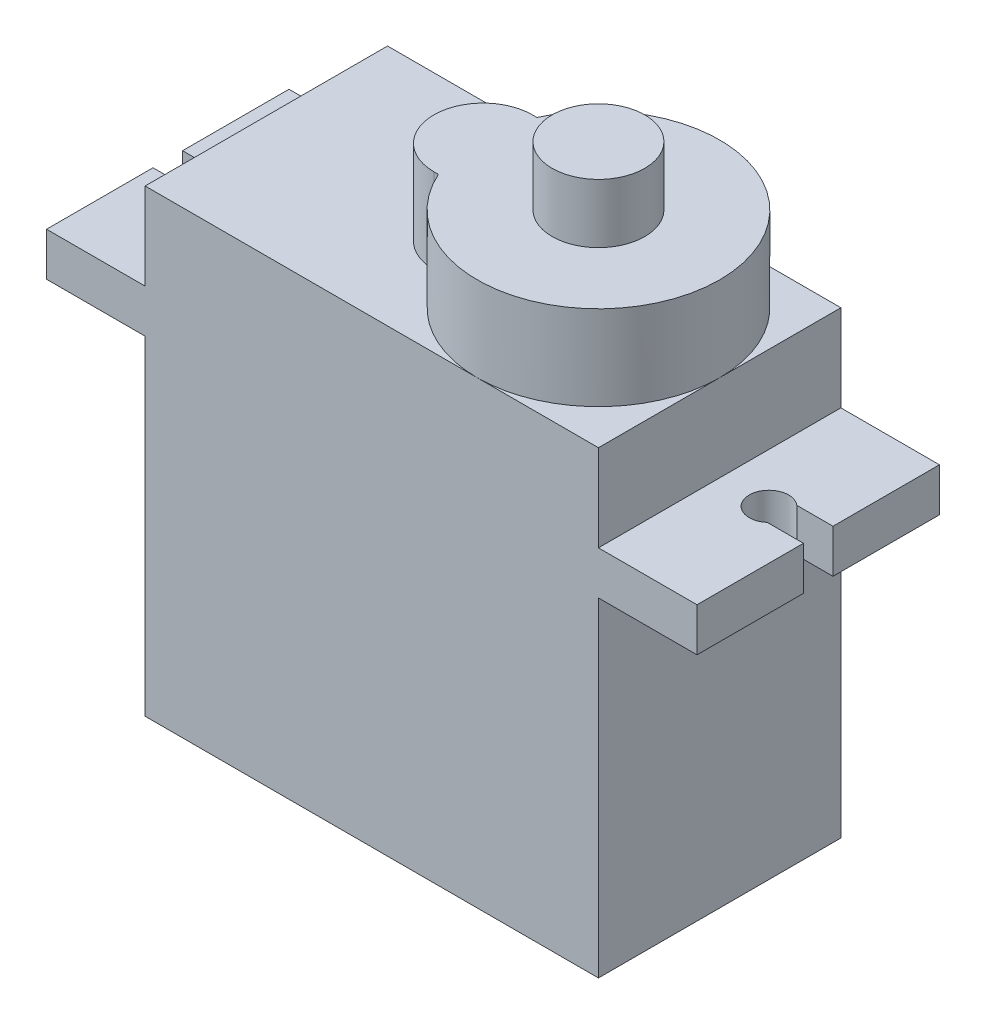
ISO-10303-21;
HEADER;
FILE_DESCRIPTION(('STEP AP214'),'2;1');
FILE_NAME('part.step','',(''),(''),'','','');
FILE_SCHEMA(('AUTOMOTIVE_DESIGN { 1 0 10303 214 1 1 1 1 }'));
ENDSEC;
DATA;
#1=APPLICATION_CONTEXT('core data for automotive mechanical design processes');
#2=APPLICATION_PROTOCOL_DEFINITION('international standard','automotive_design',2000,#1);
#3=PRODUCT_CONTEXT('',#1,'mechanical');
#4=PRODUCT('Part','Part','',(#3));
#5=PRODUCT_RELATED_PRODUCT_CATEGORY('part','',(#4));
#6=PRODUCT_DEFINITION_FORMATION('','',#4);
#7=PRODUCT_DEFINITION_CONTEXT('part definition',#1,'design');
#8=PRODUCT_DEFINITION('design','',#6,#7);
#9=PRODUCT_DEFINITION_SHAPE('','',#8);
#10=(LENGTH_UNIT() NAMED_UNIT(*) SI_UNIT(.MILLI.,.METRE.));
#11=(NAMED_UNIT(*) PLANE_ANGLE_UNIT() SI_UNIT($,.RADIAN.));
#12=(NAMED_UNIT(*) SI_UNIT($,.STERADIAN.) SOLID_ANGLE_UNIT());
#13=UNCERTAINTY_MEASURE_WITH_UNIT(LENGTH_MEASURE(1.E-05),#10,'distance_accuracy_value','');
#14=(GEOMETRIC_REPRESENTATION_CONTEXT(3) GLOBAL_UNCERTAINTY_ASSIGNED_CONTEXT((#13)) GLOBAL_UNIT_ASSIGNED_CONTEXT((#10,
#11,#12)) REPRESENTATION_CONTEXT('',''));
#15=CARTESIAN_POINT('',(0.,0.,0.));
#16=DIRECTION('',(0.,0.,1.));
#17=DIRECTION('',(1.,0.,0.));
#18=AXIS2_PLACEMENT_3D('',#15,#16,#17);
#19=CARTESIAN_POINT('',(0.,27.6,0.));
#20=DIRECTION('',(0.,1.,0.));
#21=DIRECTION('',(0.,0.,1.));
#22=AXIS2_PLACEMENT_3D('',#19,#20,#21);
#23=PLANE('',#22);
#24=CARTESIAN_POINT('',(16.85,27.6,-6.14999999999991));
#25=DIRECTION('',(0.,1.,0.));
#26=DIRECTION('',(0.,0.,1.));
#27=AXIS2_PLACEMENT_3D('',#24,#25,#26);
#28=CIRCLE('',#27,6.14999999999998);
#29=CARTESIAN_POINT('',(11.2310588186029,27.6,-3.65));
#30=VERTEX_POINT('',#29);
#31=CARTESIAN_POINT('',(11.231058818603,27.6,-8.65));
#32=VERTEX_POINT('',#31);
#33=EDGE_CURVE('E211',#30,#32,#28,.T.);
#34=ORIENTED_EDGE('',*,*,#33,.T.);
#35=DIRECTION('',(1.,0.,0.));
#36=VECTOR('',#35,1.);
#37=CARTESIAN_POINT('',(0.,27.6,-8.65));
#38=LINE('',#37,#36);
#39=CARTESIAN_POINT('',(11.,27.6,-8.65));
#40=VERTEX_POINT('',#39);
#41=EDGE_CURVE('E213',#40,#32,#38,.T.);
#42=ORIENTED_EDGE('',*,*,#41,.F.);
#43=CARTESIAN_POINT('',(11.,27.6,-6.15));
#44=DIRECTION('',(0.,1.,0.));
#45=DIRECTION('',(0.,0.,1.));
#46=AXIS2_PLACEMENT_3D('',#43,#44,#45);
#47=CIRCLE('',#46,2.5);
#48=CARTESIAN_POINT('',(11.,27.6,-3.65));
#49=VERTEX_POINT('',#48);
#50=EDGE_CURVE('E230',#40,#49,#47,.T.);
#51=ORIENTED_EDGE('',*,*,#50,.T.);
#52=DIRECTION('',(1.,0.,0.));
#53=VECTOR('',#52,1.);
#54=CARTESIAN_POINT('',(0.,27.6,-3.65));
#55=LINE('',#54,#53);
#56=EDGE_CURVE('E215',#49,#30,#55,.T.);
#57=ORIENTED_EDGE('',*,*,#56,.T.);
#58=EDGE_LOOP('',(#34,#42,#51,#57));
#59=FACE_BOUND('',#58,.T.);
#60=CARTESIAN_POINT('',(16.85,27.6,-6.14999999999991));
#61=DIRECTION('',(0.,1.,0.));
#62=DIRECTION('',(0.,0.,1.));
#63=AXIS2_PLACEMENT_3D('',#60,#61,#62);
#64=CIRCLE('',#63,2.35);
#65=CARTESIAN_POINT('',(16.85,27.6,-3.79999999999991));
#66=VERTEX_POINT('',#65);
#67=EDGE_CURVE('E805',#66,#66,#64,.T.);
#68=ORIENTED_EDGE('',*,*,#67,.F.);
#69=EDGE_LOOP('',(#68));
#70=FACE_BOUND('',#69,.T.);
#71=ADVANCED_FACE('F36',(#59,#70),#23,.T.);
#72=CARTESIAN_POINT('',(0.,23.3,0.));
#73=DIRECTION('',(0.,1.,0.));
#74=DIRECTION('',(0.,0.,1.));
#75=AXIS2_PLACEMENT_3D('',#72,#73,#74);
#76=PLANE('',#75);
#77=CARTESIAN_POINT('',(16.85,23.3,-6.14999999999991));
#78=DIRECTION('',(0.,1.,0.));
#79=DIRECTION('',(0.,0.,1.));
#80=AXIS2_PLACEMENT_3D('',#77,#78,#79);
#81=CIRCLE('',#80,6.14999999999998);
#82=CARTESIAN_POINT('',(11.2310588186029,23.3,-3.65));
#83=VERTEX_POINT('',#82);
#84=CARTESIAN_POINT('',(16.85,23.3,0.));
#85=VERTEX_POINT('',#84);
#86=EDGE_CURVE('E47',#83,#85,#81,.T.);
#87=ORIENTED_EDGE('',*,*,#86,.F.);
#88=DIRECTION('',(1.,0.,0.));
#89=VECTOR('',#88,1.);
#90=CARTESIAN_POINT('',(0.,23.3,-3.65));
#91=LINE('',#90,#89);
#92=CARTESIAN_POINT('',(11.,23.3,-3.65));
#93=VERTEX_POINT('',#92);
#94=EDGE_CURVE('E219',#93,#83,#91,.T.);
#95=ORIENTED_EDGE('',*,*,#94,.F.);
#96=CARTESIAN_POINT('',(11.,23.3,-6.15));
#97=DIRECTION('',(0.,1.,0.));
#98=DIRECTION('',(0.,0.,1.));
#99=AXIS2_PLACEMENT_3D('',#96,#97,#98);
#100=CIRCLE('',#99,2.5);
#101=CARTESIAN_POINT('',(11.,23.3,-8.65));
#102=VERTEX_POINT('',#101);
#103=EDGE_CURVE('E240',#102,#93,#100,.T.);
#104=ORIENTED_EDGE('',*,*,#103,.F.);
#105=DIRECTION('',(1.,0.,0.));
#106=VECTOR('',#105,1.);
#107=CARTESIAN_POINT('',(0.,23.3,-8.65));
#108=LINE('',#107,#106);
#109=CARTESIAN_POINT('',(11.231058818603,23.3,-8.65));
#110=VERTEX_POINT('',#109);
#111=EDGE_CURVE('E237',#102,#110,#108,.T.);
#112=ORIENTED_EDGE('',*,*,#111,.T.);
#113=CARTESIAN_POINT('',(16.85,23.3,-12.2999999999999));
#114=VERTEX_POINT('',#113);
#115=EDGE_CURVE('E223',#114,#110,#81,.T.);
#116=ORIENTED_EDGE('',*,*,#115,.F.);
#117=DIRECTION('',(-1.,0.,0.));
#118=VECTOR('',#117,1.);
#119=CARTESIAN_POINT('',(0.,23.3,-12.3));
#120=LINE('',#119,#118);
#121=CARTESIAN_POINT('',(0.,23.3,-12.3));
#122=VERTEX_POINT('',#121);
#123=EDGE_CURVE('E403',#114,#122,#120,.T.);
#124=ORIENTED_EDGE('',*,*,#123,.T.);
#125=DIRECTION('',(0.,0.,1.));
#126=VECTOR('',#125,1.);
#127=CARTESIAN_POINT('',(0.,23.3,0.));
#128=LINE('',#127,#126);
#129=CARTESIAN_POINT('',(0.,23.3,0.));
#130=VERTEX_POINT('',#129);
#131=EDGE_CURVE('E402',#122,#130,#128,.T.);
#132=ORIENTED_EDGE('',*,*,#131,.T.);
#133=DIRECTION('',(1.,0.,0.));
#134=VECTOR('',#133,1.);
#135=CARTESIAN_POINT('',(0.,23.3,0.));
#136=LINE('',#135,#134);
#137=EDGE_CURVE('E337',#130,#85,#136,.T.);
#138=ORIENTED_EDGE('',*,*,#137,.T.);
#139=EDGE_LOOP('',(#87,#95,#104,#112,#116,#124,#132,#138));
#140=FACE_BOUND('',#139,.T.);
#141=ADVANCED_FACE('F505',(#140),#76,.T.);
#142=CARTESIAN_POINT('',(23.,23.3,-6.14999999999991));
#143=VERTEX_POINT('',#142);
#144=EDGE_CURVE('E11',#85,#143,#81,.T.);
#145=ORIENTED_EDGE('',*,*,#144,.F.);
#146=CARTESIAN_POINT('',(23.,23.3,0.));
#147=VERTEX_POINT('',#146);
#148=EDGE_CURVE('E405',#85,#147,#136,.T.);
#149=ORIENTED_EDGE('',*,*,#148,.T.);
#150=DIRECTION('',(0.,0.,-1.));
#151=VECTOR('',#150,1.);
#152=CARTESIAN_POINT('',(23.,23.3,0.));
#153=LINE('',#152,#151);
#154=EDGE_CURVE('E408',#147,#143,#153,.T.);
#155=ORIENTED_EDGE('',*,*,#154,.T.);
#156=EDGE_LOOP('',(#145,#149,#155));
#157=FACE_BOUND('',#156,.T.);
#158=ADVANCED_FACE('F510',(#157),#76,.T.);
#159=CARTESIAN_POINT('',(23.,16.7,-17.7626001134991));
#160=DIRECTION('',(0.,-1.,0.));
#161=DIRECTION('',(0.,0.,-1.));
#162=AXIS2_PLACEMENT_3D('',#159,#160,#161);
#163=PLANE('',#162);
#164=CARTESIAN_POINT('',(-2.5,16.7,-6.15));
#165=DIRECTION('',(0.,-1.,0.));
#166=DIRECTION('',(0.,0.,-1.));
#167=AXIS2_PLACEMENT_3D('',#164,#165,#166);
#168=CIRCLE('',#167,1.);
#169=CARTESIAN_POINT('',(-3.16143782776615,16.7,-5.4));
#170=VERTEX_POINT('',#169);
#171=CARTESIAN_POINT('',(-3.16143782776615,16.7,-6.9));
#172=VERTEX_POINT('',#171);
#173=EDGE_CURVE('E266',#170,#172,#168,.F.);
#174=ORIENTED_EDGE('',*,*,#173,.T.);
#175=DIRECTION('',(-1.,0.,0.));
#176=VECTOR('',#175,1.);
#177=CARTESIAN_POINT('',(23.,16.7,-6.9));
#178=LINE('',#177,#176);
#179=CARTESIAN_POINT('',(-5.,16.7,-6.9));
#180=VERTEX_POINT('',#179);
#181=EDGE_CURVE('E269',#172,#180,#178,.T.);
#182=ORIENTED_EDGE('',*,*,#181,.T.);
#183=DIRECTION('',(0.,0.,1.));
#184=VECTOR('',#183,1.);
#185=CARTESIAN_POINT('',(-5.,16.7,-17.7626001134991));
#186=LINE('',#185,#184);
#187=CARTESIAN_POINT('',(-5.,16.7,-12.3));
#188=VERTEX_POINT('',#187);
#189=EDGE_CURVE('E282',#188,#180,#186,.T.);
#190=ORIENTED_EDGE('',*,*,#189,.F.);
#191=DIRECTION('',(-1.,0.,0.));
#192=VECTOR('',#191,1.);
#193=CARTESIAN_POINT('',(23.,16.7,-12.3));
#194=LINE('',#193,#192);
#195=CARTESIAN_POINT('',(0.,16.7,-12.3));
#196=VERTEX_POINT('',#195);
#197=EDGE_CURVE('E275',#196,#188,#194,.T.);
#198=ORIENTED_EDGE('',*,*,#197,.F.);
#199=DIRECTION('',(0.,0.,1.));
#200=VECTOR('',#199,1.);
#201=CARTESIAN_POINT('',(0.,16.7,-17.7626001134991));
#202=LINE('',#201,#200);
#203=CARTESIAN_POINT('',(0.,16.7,0.));
#204=VERTEX_POINT('',#203);
#205=EDGE_CURVE('E280',#196,#204,#202,.T.);
#206=ORIENTED_EDGE('',*,*,#205,.T.);
#207=DIRECTION('',(1.,0.,0.));
#208=VECTOR('',#207,1.);
#209=CARTESIAN_POINT('',(23.,16.7,0.));
#210=LINE('',#209,#208);
#211=CARTESIAN_POINT('',(-5.,16.7,0.));
#212=VERTEX_POINT('',#211);
#213=EDGE_CURVE('E272',#212,#204,#210,.T.);
#214=ORIENTED_EDGE('',*,*,#213,.F.);
#215=CARTESIAN_POINT('',(-5.,16.7,-5.4));
#216=VERTEX_POINT('',#215);
#217=EDGE_CURVE('E285',#216,#212,#186,.T.);
#218=ORIENTED_EDGE('',*,*,#217,.F.);
#219=DIRECTION('',(1.,0.,0.));
#220=VECTOR('',#219,1.);
#221=CARTESIAN_POINT('',(23.,16.7,-5.4));
#222=LINE('',#221,#220);
#223=EDGE_CURVE('E258',#216,#170,#222,.T.);
#224=ORIENTED_EDGE('',*,*,#223,.T.);
#225=EDGE_LOOP('',(#174,#182,#190,#198,#206,#214,#218,#224));
#226=FACE_BOUND('',#225,.T.);
#227=ADVANCED_FACE('F480',(#226),#163,.T.);
#228=CARTESIAN_POINT('',(-5.,0.,-17.7626001134991));
#229=DIRECTION('',(-1.,0.,0.));
#230=DIRECTION('',(0.,0.,1.));
#231=AXIS2_PLACEMENT_3D('',#228,#229,#230);
#232=PLANE('',#231);
#233=ORIENTED_EDGE('',*,*,#189,.T.);
#234=DIRECTION('',(0.,1.,0.));
#235=VECTOR('',#234,1.);
#236=CARTESIAN_POINT('',(-5.,-2.50000000007189E-05,-6.9));
#237=LINE('',#236,#235);
#238=CARTESIAN_POINT('',(-5.,18.9,-6.9));
#239=VERTEX_POINT('',#238);
#240=EDGE_CURVE('E255',#180,#239,#237,.T.);
#241=ORIENTED_EDGE('',*,*,#240,.T.);
#242=DIRECTION('',(0.,0.,1.));
#243=VECTOR('',#242,1.);
#244=CARTESIAN_POINT('',(-5.,18.9,-17.7626001134991));
#245=LINE('',#244,#243);
#246=CARTESIAN_POINT('',(-5.,18.9,-12.3));
#247=VERTEX_POINT('',#246);
#248=EDGE_CURVE('E286',#247,#239,#245,.T.);
#249=ORIENTED_EDGE('',*,*,#248,.F.);
#250=DIRECTION('',(0.,1.,0.));
#251=VECTOR('',#250,1.);
#252=CARTESIAN_POINT('',(-5.,0.,-12.3));
#253=LINE('',#252,#251);
#254=EDGE_CURVE('E273',#188,#247,#253,.T.);
#255=ORIENTED_EDGE('',*,*,#254,.F.);
#256=EDGE_LOOP('',(#233,#241,#249,#255));
#257=FACE_BOUND('',#256,.T.);
#258=ADVANCED_FACE('F484',(#257),#232,.T.);
#259=CARTESIAN_POINT('',(-5.,18.9,-5.4));
#260=VERTEX_POINT('',#259);
#261=CARTESIAN_POINT('',(-5.,18.9,0.));
#262=VERTEX_POINT('',#261);
#263=EDGE_CURVE('E289',#260,#262,#245,.T.);
#264=ORIENTED_EDGE('',*,*,#263,.F.);
#265=DIRECTION('',(0.,1.,0.));
#266=VECTOR('',#265,1.);
#267=CARTESIAN_POINT('',(-5.,-2.50000000007189E-05,-5.4));
#268=LINE('',#267,#266);
#269=EDGE_CURVE('E62',#216,#260,#268,.T.);
#270=ORIENTED_EDGE('',*,*,#269,.F.);
#271=ORIENTED_EDGE('',*,*,#217,.T.);
#272=DIRECTION('',(0.,-1.,0.));
#273=VECTOR('',#272,1.);
#274=CARTESIAN_POINT('',(-5.,0.,0.));
#275=LINE('',#274,#273);
#276=EDGE_CURVE('E277',#262,#212,#275,.T.);
#277=ORIENTED_EDGE('',*,*,#276,.F.);
#278=EDGE_LOOP('',(#264,#270,#271,#277));
#279=FACE_BOUND('',#278,.T.);
#280=ADVANCED_FACE('F495',(#279),#232,.T.);
#281=CARTESIAN_POINT('',(23.,18.9,-17.7626001134991));
#282=DIRECTION('',(0.,1.,0.));
#283=DIRECTION('',(0.,0.,1.));
#284=AXIS2_PLACEMENT_3D('',#281,#282,#283);
#285=PLANE('',#284);
#286=ORIENTED_EDGE('',*,*,#248,.T.);
#287=DIRECTION('',(1.,0.,0.));
#288=VECTOR('',#287,1.);
#289=CARTESIAN_POINT('',(-5.,18.9,-6.9));
#290=LINE('',#289,#288);
#291=CARTESIAN_POINT('',(-3.16143782776615,18.9,-6.9));
#292=VERTEX_POINT('',#291);
#293=EDGE_CURVE('E252',#239,#292,#290,.T.);
#294=ORIENTED_EDGE('',*,*,#293,.T.);
#295=CARTESIAN_POINT('',(-2.5,18.9,-6.15));
#296=DIRECTION('',(0.,-1.,0.));
#297=DIRECTION('',(0.,0.,1.));
#298=AXIS2_PLACEMENT_3D('',#295,#296,#297);
#299=CIRCLE('',#298,1.);
#300=CARTESIAN_POINT('',(-3.16143782776615,18.9,-5.4));
#301=VERTEX_POINT('',#300);
#302=EDGE_CURVE('E249',#292,#301,#299,.T.);
#303=ORIENTED_EDGE('',*,*,#302,.T.);
#304=DIRECTION('',(-1.,0.,0.));
#305=VECTOR('',#304,1.);
#306=CARTESIAN_POINT('',(-5.,18.9,-5.4));
#307=LINE('',#306,#305);
#308=EDGE_CURVE('E225',#301,#260,#307,.T.);
#309=ORIENTED_EDGE('',*,*,#308,.T.);
#310=ORIENTED_EDGE('',*,*,#263,.T.);
#311=DIRECTION('',(-1.,0.,0.));
#312=VECTOR('',#311,1.);
#313=CARTESIAN_POINT('',(23.,18.9,0.));
#314=LINE('',#313,#312);
#315=CARTESIAN_POINT('',(0.,18.9,0.));
#316=VERTEX_POINT('',#315);
#317=EDGE_CURVE('E281',#316,#262,#314,.T.);
#318=ORIENTED_EDGE('',*,*,#317,.F.);
#319=DIRECTION('',(0.,0.,1.));
#320=VECTOR('',#319,1.);
#321=CARTESIAN_POINT('',(0.,18.9,-17.7626001134991));
#322=LINE('',#321,#320);
#323=CARTESIAN_POINT('',(0.,18.9,-12.3));
#324=VERTEX_POINT('',#323);
#325=EDGE_CURVE('E295',#324,#316,#322,.T.);
#326=ORIENTED_EDGE('',*,*,#325,.F.);
#327=DIRECTION('',(1.,0.,0.));
#328=VECTOR('',#327,1.);
#329=CARTESIAN_POINT('',(23.,18.9,-12.3));
#330=LINE('',#329,#328);
#331=EDGE_CURVE('E276',#247,#324,#330,.T.);
#332=ORIENTED_EDGE('',*,*,#331,.F.);
#333=EDGE_LOOP('',(#286,#294,#303,#309,#310,#318,#326,#332));
#334=FACE_BOUND('',#333,.T.);
#335=ADVANCED_FACE('F326',(#334),#285,.T.);
#336=CARTESIAN_POINT('',(0.,23.3,0.));
#337=DIRECTION('',(1.,0.,0.));
#338=DIRECTION('',(0.,0.,-1.));
#339=AXIS2_PLACEMENT_3D('',#336,#337,#338);
#340=PLANE('',#339);
#341=ORIENTED_EDGE('',*,*,#205,.F.);
#342=DIRECTION('',(0.,-1.,0.));
#343=VECTOR('',#342,1.);
#344=CARTESIAN_POINT('',(0.,23.3,-12.3));
#345=LINE('',#344,#343);
#346=CARTESIAN_POINT('',(0.,0.,-12.3));
#347=VERTEX_POINT('',#346);
#348=EDGE_CURVE('E338',#196,#347,#345,.T.);
#349=ORIENTED_EDGE('',*,*,#348,.T.);
#350=DIRECTION('',(0.,0.,1.));
#351=VECTOR('',#350,1.);
#352=CARTESIAN_POINT('',(0.,0.,0.));
#353=LINE('',#352,#351);
#354=CARTESIAN_POINT('',(0.,0.,0.));
#355=VERTEX_POINT('',#354);
#356=EDGE_CURVE('E414',#347,#355,#353,.T.);
#357=ORIENTED_EDGE('',*,*,#356,.T.);
#358=DIRECTION('',(0.,-1.,0.));
#359=VECTOR('',#358,1.);
#360=CARTESIAN_POINT('',(0.,23.3,0.));
#361=LINE('',#360,#359);
#362=EDGE_CURVE('E339',#204,#355,#361,.T.);
#363=ORIENTED_EDGE('',*,*,#362,.F.);
#364=EDGE_LOOP('',(#341,#349,#357,#363));
#365=FACE_BOUND('',#364,.T.);
#366=ADVANCED_FACE('F477',(#365),#340,.F.);
#367=CARTESIAN_POINT('',(28.,0.,-17.7626001134991));
#368=DIRECTION('',(-1.,0.,0.));
#369=DIRECTION('',(0.,0.,1.));
#370=AXIS2_PLACEMENT_3D('',#367,#368,#369);
#371=PLANE('',#370);
#372=DIRECTION('',(0.,0.,1.));
#373=VECTOR('',#372,1.);
#374=CARTESIAN_POINT('',(28.,16.7,-17.7626001134991));
#375=LINE('',#374,#373);
#376=CARTESIAN_POINT('',(28.,16.7,-5.4));
#377=VERTEX_POINT('',#376);
#378=CARTESIAN_POINT('',(28.,16.7,0.));
#379=VERTEX_POINT('',#378);
#380=EDGE_CURVE('E372',#377,#379,#375,.T.);
#381=ORIENTED_EDGE('',*,*,#380,.F.);
#382=DIRECTION('',(0.,1.,0.));
#383=VECTOR('',#382,1.);
#384=CARTESIAN_POINT('',(28.,-2.50000000007189E-05,-5.4));
#385=LINE('',#384,#383);
#386=CARTESIAN_POINT('',(28.,18.9,-5.4));
#387=VERTEX_POINT('',#386);
#388=EDGE_CURVE('E430',#377,#387,#385,.T.);
#389=ORIENTED_EDGE('',*,*,#388,.T.);
#390=DIRECTION('',(0.,0.,1.));
#391=VECTOR('',#390,1.);
#392=CARTESIAN_POINT('',(28.,18.9,-17.7626001134991));
#393=LINE('',#392,#391);
#394=CARTESIAN_POINT('',(28.,18.9,0.));
#395=VERTEX_POINT('',#394);
#396=EDGE_CURVE('E394',#387,#395,#393,.T.);
#397=ORIENTED_EDGE('',*,*,#396,.T.);
#398=DIRECTION('',(0.,-1.,0.));
#399=VECTOR('',#398,1.);
#400=CARTESIAN_POINT('',(28.,0.,0.));
#401=LINE('',#400,#399);
#402=EDGE_CURVE('E373',#395,#379,#401,.T.);
#403=ORIENTED_EDGE('',*,*,#402,.T.);
#404=EDGE_LOOP('',(#381,#389,#397,#403));
#405=FACE_BOUND('',#404,.T.);
#406=ADVANCED_FACE('F460',(#405),#371,.F.);
#407=CARTESIAN_POINT('',(23.,23.3,0.));
#408=DIRECTION('',(-1.,0.,0.));
#409=DIRECTION('',(0.,0.,1.));
#410=AXIS2_PLACEMENT_3D('',#407,#408,#409);
#411=PLANE('',#410);
#412=DIRECTION('',(0.,0.,1.));
#413=VECTOR('',#412,1.);
#414=CARTESIAN_POINT('',(23.,18.9,-17.7626001134991));
#415=LINE('',#414,#413);
#416=CARTESIAN_POINT('',(23.,18.9,-12.3));
#417=VERTEX_POINT('',#416);
#418=CARTESIAN_POINT('',(23.,18.9,0.));
#419=VERTEX_POINT('',#418);
#420=EDGE_CURVE('E380',#417,#419,#415,.T.);
#421=ORIENTED_EDGE('',*,*,#420,.F.);
#422=DIRECTION('',(0.,-1.,0.));
#423=VECTOR('',#422,1.);
#424=CARTESIAN_POINT('',(23.,23.3,-12.3));
#425=LINE('',#424,#423);
#426=CARTESIAN_POINT('',(23.,23.3,-12.3));
#427=VERTEX_POINT('',#426);
#428=EDGE_CURVE('E356',#427,#417,#425,.T.);
#429=ORIENTED_EDGE('',*,*,#428,.F.);
#430=EDGE_CURVE('E407',#143,#427,#153,.T.);
#431=ORIENTED_EDGE('',*,*,#430,.F.);
#432=ORIENTED_EDGE('',*,*,#154,.F.);
#433=DIRECTION('',(0.,-1.,0.));
#434=VECTOR('',#433,1.);
#435=CARTESIAN_POINT('',(23.,23.3,0.));
#436=LINE('',#435,#434);
#437=EDGE_CURVE('E341',#147,#419,#436,.T.);
#438=ORIENTED_EDGE('',*,*,#437,.T.);
#439=EDGE_LOOP('',(#421,#429,#431,#432,#438));
#440=FACE_BOUND('',#439,.T.);
#441=ADVANCED_FACE('F660',(#440),#411,.F.);
#442=CARTESIAN_POINT('',(0.,23.3,-12.3));
#443=DIRECTION('',(0.,0.,1.));
#444=DIRECTION('',(1.,0.,0.));
#445=AXIS2_PLACEMENT_3D('',#442,#443,#444);
#446=PLANE('',#445);
#447=DIRECTION('',(-1.,0.,0.));
#448=VECTOR('',#447,1.);
#449=CARTESIAN_POINT('',(0.,0.,-12.3));
#450=LINE('',#449,#448);
#451=CARTESIAN_POINT('',(23.,0.,-12.3));
#452=VERTEX_POINT('',#451);
#453=EDGE_CURVE('E412',#452,#347,#450,.T.);
#454=ORIENTED_EDGE('',*,*,#453,.T.);
#455=ORIENTED_EDGE('',*,*,#348,.F.);
#456=ORIENTED_EDGE('',*,*,#197,.T.);
#457=ORIENTED_EDGE('',*,*,#254,.T.);
#458=ORIENTED_EDGE('',*,*,#331,.T.);
#459=EDGE_CURVE('E322',#122,#324,#345,.T.);
#460=ORIENTED_EDGE('',*,*,#459,.F.);
#461=ORIENTED_EDGE('',*,*,#123,.F.);
#462=EDGE_CURVE('E399',#427,#114,#120,.T.);
#463=ORIENTED_EDGE('',*,*,#462,.F.);
#464=ORIENTED_EDGE('',*,*,#428,.T.);
#465=DIRECTION('',(-1.,0.,0.));
#466=VECTOR('',#465,1.);
#467=CARTESIAN_POINT('',(0.,18.9,-12.3));
#468=LINE('',#467,#466);
#469=CARTESIAN_POINT('',(28.,18.9,-12.3));
#470=VERTEX_POINT('',#469);
#471=EDGE_CURVE('E376',#470,#417,#468,.T.);
#472=ORIENTED_EDGE('',*,*,#471,.F.);
#473=DIRECTION('',(0.,1.,0.));
#474=VECTOR('',#473,1.);
#475=CARTESIAN_POINT('',(28.,0.,-12.3));
#476=LINE('',#475,#474);
#477=CARTESIAN_POINT('',(28.,16.7,-12.3));
#478=VERTEX_POINT('',#477);
#479=EDGE_CURVE('E379',#478,#470,#476,.T.);
#480=ORIENTED_EDGE('',*,*,#479,.F.);
#481=DIRECTION('',(1.,0.,0.));
#482=VECTOR('',#481,1.);
#483=CARTESIAN_POINT('',(0.,16.7,-12.3));
#484=LINE('',#483,#482);
#485=CARTESIAN_POINT('',(23.,16.7,-12.3));
#486=VERTEX_POINT('',#485);
#487=EDGE_CURVE('E378',#486,#478,#484,.T.);
#488=ORIENTED_EDGE('',*,*,#487,.F.);
#489=EDGE_CURVE('E411',#486,#452,#425,.T.);
#490=ORIENTED_EDGE('',*,*,#489,.T.);
#491=EDGE_LOOP('',(#454,#455,#456,#457,#458,#460,#461,#463,#464,#472,#480,#488,#490));
#492=FACE_BOUND('',#491,.T.);
#493=ADVANCED_FACE('F38',(#492),#446,.F.);
#494=ORIENTED_EDGE('',*,*,#459,.T.);
#495=ORIENTED_EDGE('',*,*,#325,.T.);
#496=EDGE_CURVE('E331',#130,#316,#361,.T.);
#497=ORIENTED_EDGE('',*,*,#496,.F.);
#498=ORIENTED_EDGE('',*,*,#131,.F.);
#499=EDGE_LOOP('',(#494,#495,#497,#498));
#500=FACE_BOUND('',#499,.T.);
#501=ADVANCED_FACE('F329',(#500),#340,.F.);
#502=CARTESIAN_POINT('',(0.,23.3,0.));
#503=DIRECTION('',(0.,0.,-1.));
#504=DIRECTION('',(-1.,0.,0.));
#505=AXIS2_PLACEMENT_3D('',#502,#503,#504);
#506=PLANE('',#505);
#507=DIRECTION('',(1.,0.,0.));
#508=VECTOR('',#507,1.);
#509=CARTESIAN_POINT('',(0.,0.,0.));
#510=LINE('',#509,#508);
#511=CARTESIAN_POINT('',(23.,0.,0.));
#512=VERTEX_POINT('',#511);
#513=EDGE_CURVE('E417',#355,#512,#510,.T.);
#514=ORIENTED_EDGE('',*,*,#513,.T.);
#515=CARTESIAN_POINT('',(23.,16.7,0.));
#516=VERTEX_POINT('',#515);
#517=EDGE_CURVE('E426',#516,#512,#436,.T.);
#518=ORIENTED_EDGE('',*,*,#517,.F.);
#519=DIRECTION('',(-1.,0.,0.));
#520=VECTOR('',#519,1.);
#521=CARTESIAN_POINT('',(0.,16.7,0.));
#522=LINE('',#521,#520);
#523=EDGE_CURVE('E428',#379,#516,#522,.T.);
#524=ORIENTED_EDGE('',*,*,#523,.F.);
#525=ORIENTED_EDGE('',*,*,#402,.F.);
#526=DIRECTION('',(1.,0.,0.));
#527=VECTOR('',#526,1.);
#528=CARTESIAN_POINT('',(0.,18.9,0.));
#529=LINE('',#528,#527);
#530=EDGE_CURVE('E369',#419,#395,#529,.T.);
#531=ORIENTED_EDGE('',*,*,#530,.F.);
#532=ORIENTED_EDGE('',*,*,#437,.F.);
#533=ORIENTED_EDGE('',*,*,#148,.F.);
#534=ORIENTED_EDGE('',*,*,#137,.F.);
#535=ORIENTED_EDGE('',*,*,#496,.T.);
#536=ORIENTED_EDGE('',*,*,#317,.T.);
#537=ORIENTED_EDGE('',*,*,#276,.T.);
#538=ORIENTED_EDGE('',*,*,#213,.T.);
#539=ORIENTED_EDGE('',*,*,#362,.T.);
#540=EDGE_LOOP('',(#514,#518,#524,#525,#531,#532,#533,#534,#535,#536,#537,#538,#539));
#541=FACE_BOUND('',#540,.T.);
#542=ADVANCED_FACE('F334',(#541),#506,.F.);
#543=ORIENTED_EDGE('',*,*,#489,.F.);
#544=DIRECTION('',(0.,0.,1.));
#545=VECTOR('',#544,1.);
#546=CARTESIAN_POINT('',(23.,16.7,-17.7626001134991));
#547=LINE('',#546,#545);
#548=EDGE_CURVE('E383',#486,#516,#547,.T.);
#549=ORIENTED_EDGE('',*,*,#548,.T.);
#550=ORIENTED_EDGE('',*,*,#517,.T.);
#551=DIRECTION('',(0.,0.,-1.));
#552=VECTOR('',#551,1.);
#553=CARTESIAN_POINT('',(23.,0.,0.));
#554=LINE('',#553,#552);
#555=EDGE_CURVE('E419',#512,#452,#554,.T.);
#556=ORIENTED_EDGE('',*,*,#555,.T.);
#557=EDGE_LOOP('',(#543,#549,#550,#556));
#558=FACE_BOUND('',#557,.T.);
#559=ADVANCED_FACE('F467',(#558),#411,.F.);
#560=EDGE_CURVE('E45',#143,#114,#81,.T.);
#561=ORIENTED_EDGE('',*,*,#560,.F.);
#562=ORIENTED_EDGE('',*,*,#430,.T.);
#563=ORIENTED_EDGE('',*,*,#462,.T.);
#564=EDGE_LOOP('',(#561,#562,#563));
#565=FACE_BOUND('',#564,.T.);
#566=ADVANCED_FACE('F513',(#565),#76,.T.);
#567=CARTESIAN_POINT('',(0.,0.,0.));
#568=DIRECTION('',(0.,1.,0.));
#569=DIRECTION('',(0.,0.,1.));
#570=AXIS2_PLACEMENT_3D('',#567,#568,#569);
#571=PLANE('',#570);
#572=ORIENTED_EDGE('',*,*,#453,.F.);
#573=ORIENTED_EDGE('',*,*,#555,.F.);
#574=ORIENTED_EDGE('',*,*,#513,.F.);
#575=ORIENTED_EDGE('',*,*,#356,.F.);
#576=EDGE_LOOP('',(#572,#573,#574,#575));
#577=FACE_BOUND('',#576,.T.);
#578=ADVANCED_FACE('F474',(#577),#571,.F.);
#579=CARTESIAN_POINT('',(28.,18.9,-6.9));
#580=VERTEX_POINT('',#579);
#581=EDGE_CURVE('E384',#470,#580,#393,.T.);
#582=ORIENTED_EDGE('',*,*,#581,.T.);
#583=DIRECTION('',(0.,1.,0.));
#584=VECTOR('',#583,1.);
#585=CARTESIAN_POINT('',(28.,-2.50000000007189E-05,-6.9));
#586=LINE('',#585,#584);
#587=CARTESIAN_POINT('',(28.,16.7,-6.9));
#588=VERTEX_POINT('',#587);
#589=EDGE_CURVE('E442',#588,#580,#586,.T.);
#590=ORIENTED_EDGE('',*,*,#589,.F.);
#591=EDGE_CURVE('E395',#478,#588,#375,.T.);
#592=ORIENTED_EDGE('',*,*,#591,.F.);
#593=ORIENTED_EDGE('',*,*,#479,.T.);
#594=EDGE_LOOP('',(#582,#590,#592,#593));
#595=FACE_BOUND('',#594,.T.);
#596=ADVANCED_FACE('F441',(#595),#371,.F.);
#597=CARTESIAN_POINT('',(0.,18.9,-17.7626001134991));
#598=DIRECTION('',(0.,-1.,0.));
#599=DIRECTION('',(0.,0.,-1.));
#600=AXIS2_PLACEMENT_3D('',#597,#598,#599);
#601=PLANE('',#600);
#602=ORIENTED_EDGE('',*,*,#396,.F.);
#603=DIRECTION('',(1.,0.,0.));
#604=VECTOR('',#603,1.);
#605=CARTESIAN_POINT('',(28.,18.9,-5.4));
#606=LINE('',#605,#604);
#607=CARTESIAN_POINT('',(26.1614378277662,18.9,-5.4));
#608=VERTEX_POINT('',#607);
#609=EDGE_CURVE('E448',#608,#387,#606,.T.);
#610=ORIENTED_EDGE('',*,*,#609,.F.);
#611=CARTESIAN_POINT('',(25.5,18.9,-6.15));
#612=DIRECTION('',(0.,1.,0.));
#613=DIRECTION('',(0.,0.,1.));
#614=AXIS2_PLACEMENT_3D('',#611,#612,#613);
#615=CIRCLE('',#614,1.);
#616=CARTESIAN_POINT('',(26.1614378277662,18.9,-6.9));
#617=VERTEX_POINT('',#616);
#618=EDGE_CURVE('E452',#617,#608,#615,.T.);
#619=ORIENTED_EDGE('',*,*,#618,.F.);
#620=DIRECTION('',(-1.,0.,0.));
#621=VECTOR('',#620,1.);
#622=CARTESIAN_POINT('',(28.,18.9,-6.9));
#623=LINE('',#622,#621);
#624=EDGE_CURVE('E313',#580,#617,#623,.T.);
#625=ORIENTED_EDGE('',*,*,#624,.F.);
#626=ORIENTED_EDGE('',*,*,#581,.F.);
#627=ORIENTED_EDGE('',*,*,#471,.T.);
#628=ORIENTED_EDGE('',*,*,#420,.T.);
#629=ORIENTED_EDGE('',*,*,#530,.T.);
#630=EDGE_LOOP('',(#602,#610,#619,#625,#626,#627,#628,#629));
#631=FACE_BOUND('',#630,.T.);
#632=ADVANCED_FACE('F708',(#631),#601,.F.);
#633=CARTESIAN_POINT('',(0.,16.7,-17.7626001134991));
#634=DIRECTION('',(0.,1.,0.));
#635=DIRECTION('',(0.,0.,1.));
#636=AXIS2_PLACEMENT_3D('',#633,#634,#635);
#637=PLANE('',#636);
#638=CARTESIAN_POINT('',(25.5,16.7,-6.15));
#639=DIRECTION('',(0.,1.,0.));
#640=DIRECTION('',(0.,0.,1.));
#641=AXIS2_PLACEMENT_3D('',#638,#639,#640);
#642=CIRCLE('',#641,1.);
#643=CARTESIAN_POINT('',(26.1614378277662,16.7,-6.9));
#644=VERTEX_POINT('',#643);
#645=CARTESIAN_POINT('',(26.1614378277662,16.7,-5.4));
#646=VERTEX_POINT('',#645);
#647=EDGE_CURVE('E361',#644,#646,#642,.T.);
#648=ORIENTED_EDGE('',*,*,#647,.T.);
#649=DIRECTION('',(1.,0.,0.));
#650=VECTOR('',#649,1.);
#651=CARTESIAN_POINT('',(0.,16.7,-5.4));
#652=LINE('',#651,#650);
#653=EDGE_CURVE('E345',#646,#377,#652,.T.);
#654=ORIENTED_EDGE('',*,*,#653,.T.);
#655=ORIENTED_EDGE('',*,*,#380,.T.);
#656=ORIENTED_EDGE('',*,*,#523,.T.);
#657=ORIENTED_EDGE('',*,*,#548,.F.);
#658=ORIENTED_EDGE('',*,*,#487,.T.);
#659=ORIENTED_EDGE('',*,*,#591,.T.);
#660=DIRECTION('',(-1.,0.,0.));
#661=VECTOR('',#660,1.);
#662=CARTESIAN_POINT('',(0.,16.7,-6.9));
#663=LINE('',#662,#661);
#664=EDGE_CURVE('E359',#588,#644,#663,.T.);
#665=ORIENTED_EDGE('',*,*,#664,.T.);
#666=EDGE_LOOP('',(#648,#654,#655,#656,#657,#658,#659,#665));
#667=FACE_BOUND('',#666,.T.);
#668=ADVANCED_FACE('F437',(#667),#637,.F.);
#669=CARTESIAN_POINT('',(28.,-2.50000000007189E-05,-5.4));
#670=DIRECTION('',(0.,0.,1.));
#671=DIRECTION('',(1.,0.,0.));
#672=AXIS2_PLACEMENT_3D('',#669,#670,#671);
#673=PLANE('',#672);
#674=DIRECTION('',(0.,1.,0.));
#675=VECTOR('',#674,1.);
#676=CARTESIAN_POINT('',(26.1614378277662,-2.50000000007189E-05,-5.4));
#677=LINE('',#676,#675);
#678=EDGE_CURVE('E450',#646,#608,#677,.T.);
#679=ORIENTED_EDGE('',*,*,#678,.T.);
#680=ORIENTED_EDGE('',*,*,#609,.T.);
#681=ORIENTED_EDGE('',*,*,#388,.F.);
#682=ORIENTED_EDGE('',*,*,#653,.F.);
#683=EDGE_LOOP('',(#679,#680,#681,#682));
#684=FACE_BOUND('',#683,.T.);
#685=ADVANCED_FACE('F721',(#684),#673,.F.);
#686=CARTESIAN_POINT('',(25.5,-2.50000000007189E-05,-6.15));
#687=DIRECTION('',(0.,1.,0.));
#688=DIRECTION('',(0.,0.,1.));
#689=AXIS2_PLACEMENT_3D('',#686,#687,#688);
#690=CYLINDRICAL_SURFACE('',#689,1.);
#691=DIRECTION('',(0.,1.,0.));
#692=VECTOR('',#691,1.);
#693=CARTESIAN_POINT('',(26.1614378277662,-2.50000000007189E-05,-6.9));
#694=LINE('',#693,#692);
#695=EDGE_CURVE('E447',#644,#617,#694,.T.);
#696=ORIENTED_EDGE('',*,*,#695,.T.);
#697=ORIENTED_EDGE('',*,*,#618,.T.);
#698=ORIENTED_EDGE('',*,*,#678,.F.);
#699=ORIENTED_EDGE('',*,*,#647,.F.);
#700=EDGE_LOOP('',(#696,#697,#698,#699));
#701=FACE_BOUND('',#700,.T.);
#702=ADVANCED_FACE('F728',(#701),#690,.F.);
#703=CARTESIAN_POINT('',(28.,-2.50000000007189E-05,-6.9));
#704=DIRECTION('',(0.,0.,-1.));
#705=DIRECTION('',(-1.,0.,0.));
#706=AXIS2_PLACEMENT_3D('',#703,#704,#705);
#707=PLANE('',#706);
#708=ORIENTED_EDGE('',*,*,#589,.T.);
#709=ORIENTED_EDGE('',*,*,#624,.T.);
#710=ORIENTED_EDGE('',*,*,#695,.F.);
#711=ORIENTED_EDGE('',*,*,#664,.F.);
#712=EDGE_LOOP('',(#708,#709,#710,#711));
#713=FACE_BOUND('',#712,.T.);
#714=ADVANCED_FACE('F532',(#713),#707,.F.);
#715=CARTESIAN_POINT('',(-5.,-2.50000000007189E-05,-6.9));
#716=DIRECTION('',(0.,0.,1.));
#717=DIRECTION('',(1.,0.,0.));
#718=AXIS2_PLACEMENT_3D('',#715,#716,#717);
#719=PLANE('',#718);
#720=DIRECTION('',(0.,1.,0.));
#721=VECTOR('',#720,1.);
#722=CARTESIAN_POINT('',(-3.16143782776615,-2.50000000007189E-05,-6.9));
#723=LINE('',#722,#721);
#724=EDGE_CURVE('E259',#172,#292,#723,.T.);
#725=ORIENTED_EDGE('',*,*,#724,.T.);
#726=ORIENTED_EDGE('',*,*,#293,.F.);
#727=ORIENTED_EDGE('',*,*,#240,.F.);
#728=ORIENTED_EDGE('',*,*,#181,.F.);
#729=EDGE_LOOP('',(#725,#726,#727,#728));
#730=FACE_BOUND('',#729,.T.);
#731=ADVANCED_FACE('F487',(#730),#719,.T.);
#732=CARTESIAN_POINT('',(-2.5,-2.50000000007189E-05,-6.15));
#733=DIRECTION('',(0.,1.,0.));
#734=DIRECTION('',(0.,0.,1.));
#735=AXIS2_PLACEMENT_3D('',#732,#733,#734);
#736=CYLINDRICAL_SURFACE('',#735,1.);
#737=DIRECTION('',(0.,1.,0.));
#738=VECTOR('',#737,1.);
#739=CARTESIAN_POINT('',(-3.16143782776615,-2.50000000007189E-05,-5.4));
#740=LINE('',#739,#738);
#741=EDGE_CURVE('E261',#170,#301,#740,.T.);
#742=ORIENTED_EDGE('',*,*,#741,.T.);
#743=ORIENTED_EDGE('',*,*,#302,.F.);
#744=ORIENTED_EDGE('',*,*,#724,.F.);
#745=ORIENTED_EDGE('',*,*,#173,.F.);
#746=EDGE_LOOP('',(#742,#743,#744,#745));
#747=FACE_BOUND('',#746,.T.);
#748=ADVANCED_FACE('F490',(#747),#736,.F.);
#749=CARTESIAN_POINT('',(-5.,-2.50000000007189E-05,-5.4));
#750=DIRECTION('',(0.,0.,-1.));
#751=DIRECTION('',(-1.,0.,0.));
#752=AXIS2_PLACEMENT_3D('',#749,#750,#751);
#753=PLANE('',#752);
#754=ORIENTED_EDGE('',*,*,#269,.T.);
#755=ORIENTED_EDGE('',*,*,#308,.F.);
#756=ORIENTED_EDGE('',*,*,#741,.F.);
#757=ORIENTED_EDGE('',*,*,#223,.F.);
#758=EDGE_LOOP('',(#754,#755,#756,#757));
#759=FACE_BOUND('',#758,.T.);
#760=ADVANCED_FACE('F492',(#759),#753,.T.);
#761=CARTESIAN_POINT('',(16.85,27.6,-6.14999999999991));
#762=DIRECTION('',(0.,-1.,0.));
#763=DIRECTION('',(0.,0.,-1.));
#764=AXIS2_PLACEMENT_3D('',#761,#762,#763);
#765=CYLINDRICAL_SURFACE('',#764,6.14999999999998);
#766=ORIENTED_EDGE('',*,*,#86,.T.);
#767=ORIENTED_EDGE('',*,*,#144,.T.);
#768=ORIENTED_EDGE('',*,*,#560,.T.);
#769=ORIENTED_EDGE('',*,*,#115,.T.);
#770=DIRECTION('',(0.,-1.,0.));
#771=VECTOR('',#770,1.);
#772=CARTESIAN_POINT('',(11.231058818603,27.6,-8.65));
#773=LINE('',#772,#771);
#774=EDGE_CURVE('E54',#32,#110,#773,.T.);
#775=ORIENTED_EDGE('',*,*,#774,.F.);
#776=ORIENTED_EDGE('',*,*,#33,.F.);
#777=DIRECTION('',(0.,-1.,0.));
#778=VECTOR('',#777,1.);
#779=CARTESIAN_POINT('',(11.2310588186029,27.6,-3.65));
#780=LINE('',#779,#778);
#781=EDGE_CURVE('E235',#30,#83,#780,.T.);
#782=ORIENTED_EDGE('',*,*,#781,.T.);
#783=EDGE_LOOP('',(#766,#767,#768,#769,#775,#776,#782));
#784=FACE_BOUND('',#783,.T.);
#785=ADVANCED_FACE('F221',(#784),#765,.T.);
#786=CARTESIAN_POINT('',(0.,27.6,-8.65));
#787=DIRECTION('',(0.,0.,-1.));
#788=DIRECTION('',(-1.,0.,0.));
#789=AXIS2_PLACEMENT_3D('',#786,#787,#788);
#790=PLANE('',#789);
#791=ORIENTED_EDGE('',*,*,#111,.F.);
#792=DIRECTION('',(0.,-1.,0.));
#793=VECTOR('',#792,1.);
#794=CARTESIAN_POINT('',(11.,27.6,-8.65));
#795=LINE('',#794,#793);
#796=EDGE_CURVE('E226',#40,#102,#795,.T.);
#797=ORIENTED_EDGE('',*,*,#796,.F.);
#798=ORIENTED_EDGE('',*,*,#41,.T.);
#799=ORIENTED_EDGE('',*,*,#774,.T.);
#800=EDGE_LOOP('',(#791,#797,#798,#799));
#801=FACE_BOUND('',#800,.T.);
#802=ADVANCED_FACE('F228',(#801),#790,.T.);
#803=CARTESIAN_POINT('',(11.,27.6,-6.15));
#804=DIRECTION('',(0.,-1.,0.));
#805=DIRECTION('',(0.,0.,-1.));
#806=AXIS2_PLACEMENT_3D('',#803,#804,#805);
#807=CYLINDRICAL_SURFACE('',#806,2.5);
#808=ORIENTED_EDGE('',*,*,#103,.T.);
#809=DIRECTION('',(0.,-1.,0.));
#810=VECTOR('',#809,1.);
#811=CARTESIAN_POINT('',(11.,27.6,-3.65));
#812=LINE('',#811,#810);
#813=EDGE_CURVE('E244',#49,#93,#812,.T.);
#814=ORIENTED_EDGE('',*,*,#813,.F.);
#815=ORIENTED_EDGE('',*,*,#50,.F.);
#816=ORIENTED_EDGE('',*,*,#796,.T.);
#817=EDGE_LOOP('',(#808,#814,#815,#816));
#818=FACE_BOUND('',#817,.T.);
#819=ADVANCED_FACE('F521',(#818),#807,.T.);
#820=CARTESIAN_POINT('',(0.,27.6,-3.65));
#821=DIRECTION('',(0.,0.,-1.));
#822=DIRECTION('',(-1.,0.,0.));
#823=AXIS2_PLACEMENT_3D('',#820,#821,#822);
#824=PLANE('',#823);
#825=ORIENTED_EDGE('',*,*,#94,.T.);
#826=ORIENTED_EDGE('',*,*,#781,.F.);
#827=ORIENTED_EDGE('',*,*,#56,.F.);
#828=ORIENTED_EDGE('',*,*,#813,.T.);
#829=EDGE_LOOP('',(#825,#826,#827,#828));
#830=FACE_BOUND('',#829,.T.);
#831=ADVANCED_FACE('F518',(#830),#824,.F.);
#832=CARTESIAN_POINT('',(16.85,30.6,-6.14999999999991));
#833=DIRECTION('',(0.,-1.,0.));
#834=DIRECTION('',(0.,0.,-1.));
#835=AXIS2_PLACEMENT_3D('',#832,#833,#834);
#836=CYLINDRICAL_SURFACE('',#835,2.35);
#837=CARTESIAN_POINT('',(16.85,30.6,-6.14999999999991));
#838=DIRECTION('',(0.,1.,0.));
#839=DIRECTION('',(0.,0.,1.));
#840=AXIS2_PLACEMENT_3D('',#837,#838,#839);
#841=CIRCLE('',#840,2.35);
#842=CARTESIAN_POINT('',(16.85,30.6,-3.79999999999991));
#843=VERTEX_POINT('',#842);
#844=EDGE_CURVE('E238',#843,#843,#841,.T.);
#845=ORIENTED_EDGE('',*,*,#844,.F.);
#846=EDGE_LOOP('',(#845));
#847=FACE_BOUND('',#846,.T.);
#848=ORIENTED_EDGE('',*,*,#67,.T.);
#849=EDGE_LOOP('',(#848));
#850=FACE_BOUND('',#849,.T.);
#851=ADVANCED_FACE('F516',(#847,#850),#836,.T.);
#852=CARTESIAN_POINT('',(16.85,30.6,-6.14999999999991));
#853=DIRECTION('',(0.,1.,0.));
#854=DIRECTION('',(0.,0.,1.));
#855=AXIS2_PLACEMENT_3D('',#852,#853,#854);
#856=PLANE('',#855);
#857=ORIENTED_EDGE('',*,*,#844,.T.);
#858=EDGE_LOOP('',(#857));
#859=FACE_BOUND('',#858,.T.);
#860=ADVANCED_FACE('F563',(#859),#856,.T.);
#861=CLOSED_SHELL('',(#71,#141,#158,#227,#258,#280,#335,#366,#406,#441,#493,#501,#542,#559,#566,
#578,#596,#632,#668,#685,#702,#714,#731,#748,#760,#785,#802,#819,#831,#851,#860));
#862=MANIFOLD_SOLID_BREP('B2',#861);
#863=ADVANCED_BREP_SHAPE_REPRESENTATION('',(#18,#862),#14);
#864=SHAPE_DEFINITION_REPRESENTATION(#9,#863);
ENDSEC;
END-ISO-10303-21;
